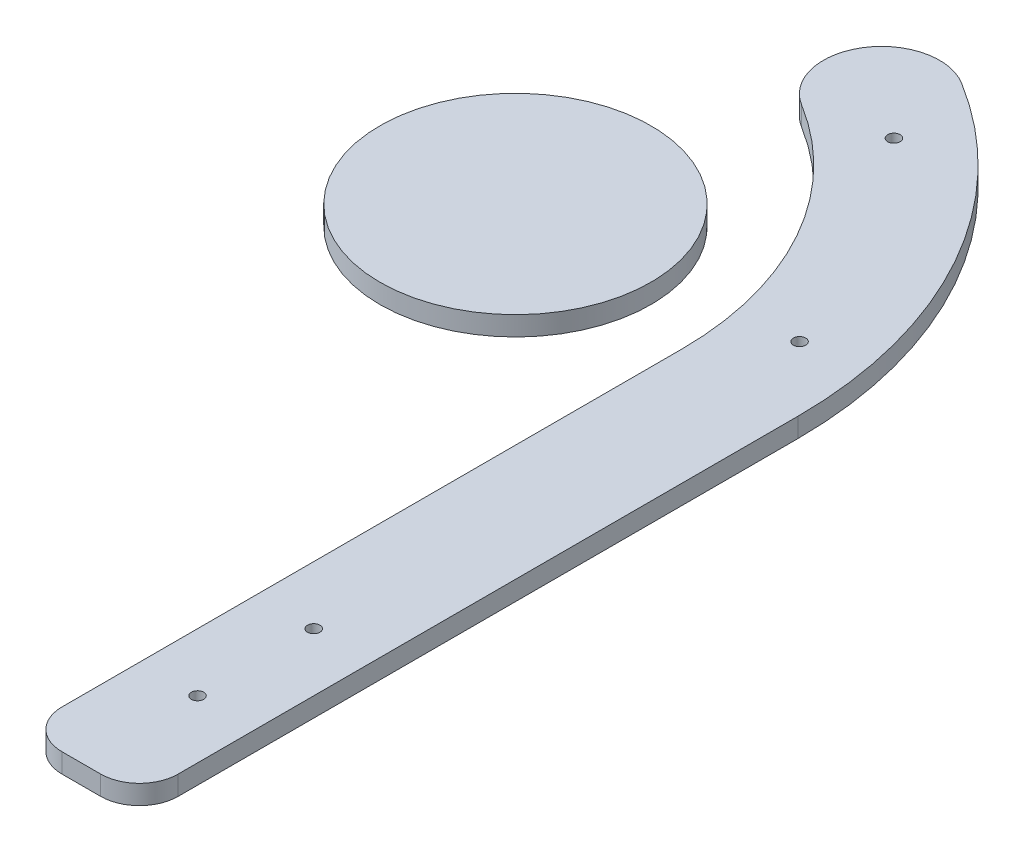
ISO-10303-21;
HEADER;
FILE_DESCRIPTION(('STEP AP214'),'2;1');
FILE_NAME('part.step','',(''),(''),'','','');
FILE_SCHEMA(('AUTOMOTIVE_DESIGN { 1 0 10303 214 1 1 1 1 }'));
ENDSEC;
DATA;
#1=APPLICATION_CONTEXT('core data for automotive mechanical design processes');
#2=APPLICATION_PROTOCOL_DEFINITION('international standard','automotive_design',2000,#1);
#3=PRODUCT_CONTEXT('',#1,'mechanical');
#4=PRODUCT('Part','Part','',(#3));
#5=PRODUCT_RELATED_PRODUCT_CATEGORY('part','',(#4));
#6=PRODUCT_DEFINITION_FORMATION('','',#4);
#7=PRODUCT_DEFINITION_CONTEXT('part definition',#1,'design');
#8=PRODUCT_DEFINITION('design','',#6,#7);
#9=PRODUCT_DEFINITION_SHAPE('','',#8);
#10=(LENGTH_UNIT() NAMED_UNIT(*) SI_UNIT(.MILLI.,.METRE.));
#11=(NAMED_UNIT(*) PLANE_ANGLE_UNIT() SI_UNIT($,.RADIAN.));
#12=(NAMED_UNIT(*) SI_UNIT($,.STERADIAN.) SOLID_ANGLE_UNIT());
#13=UNCERTAINTY_MEASURE_WITH_UNIT(LENGTH_MEASURE(1.E-05),#10,'distance_accuracy_value','');
#14=(GEOMETRIC_REPRESENTATION_CONTEXT(3) GLOBAL_UNCERTAINTY_ASSIGNED_CONTEXT((#13)) GLOBAL_UNIT_ASSIGNED_CONTEXT((#10,
#11,#12)) REPRESENTATION_CONTEXT('',''));
#15=CARTESIAN_POINT('',(0.,0.,0.));
#16=DIRECTION('',(0.,0.,1.));
#17=DIRECTION('',(1.,0.,0.));
#18=AXIS2_PLACEMENT_3D('',#15,#16,#17);
#19=CARTESIAN_POINT('',(-53.914829358916,5.,-180.99626119431));
#20=DIRECTION('',(0.,-1.,0.));
#21=DIRECTION('',(0.,0.,-1.));
#22=AXIS2_PLACEMENT_3D('',#19,#20,#21);
#23=CYLINDRICAL_SURFACE('',#22,35.);
#24=CARTESIAN_POINT('',(-53.914829358916,5.,-180.99626119431));
#25=DIRECTION('',(0.,1.,0.));
#26=DIRECTION('',(0.,0.,1.));
#27=AXIS2_PLACEMENT_3D('',#24,#25,#26);
#28=CIRCLE('',#27,35.);
#29=CARTESIAN_POINT('',(-53.914829358916,5.,-145.99626119431));
#30=VERTEX_POINT('',#29);
#31=EDGE_CURVE('E11',#30,#30,#28,.T.);
#32=ORIENTED_EDGE('',*,*,#31,.F.);
#33=EDGE_LOOP('',(#32));
#34=FACE_BOUND('',#33,.T.);
#35=CARTESIAN_POINT('',(-53.914829358916,0.,-180.99626119431));
#36=DIRECTION('',(0.,1.,0.));
#37=DIRECTION('',(0.,0.,1.));
#38=AXIS2_PLACEMENT_3D('',#35,#36,#37);
#39=CIRCLE('',#38,35.);
#40=CARTESIAN_POINT('',(-53.914829358916,0.,-145.99626119431));
#41=VERTEX_POINT('',#40);
#42=EDGE_CURVE('E42',#41,#41,#39,.T.);
#43=ORIENTED_EDGE('',*,*,#42,.T.);
#44=EDGE_LOOP('',(#43));
#45=FACE_BOUND('',#44,.T.);
#46=ADVANCED_FACE('F39',(#34,#45),#23,.T.);
#47=CARTESIAN_POINT('',(-53.914829358916,5.,-180.99626119431));
#48=DIRECTION('',(0.,1.,0.));
#49=DIRECTION('',(0.,0.,1.));
#50=AXIS2_PLACEMENT_3D('',#47,#48,#49);
#51=PLANE('',#50);
#52=ORIENTED_EDGE('',*,*,#31,.T.);
#53=EDGE_LOOP('',(#52));
#54=FACE_BOUND('',#53,.T.);
#55=ADVANCED_FACE('F54',(#54),#51,.T.);
#56=CARTESIAN_POINT('',(-53.914829358916,0.,-180.99626119431));
#57=DIRECTION('',(0.,1.,0.));
#58=DIRECTION('',(0.,0.,1.));
#59=AXIS2_PLACEMENT_3D('',#56,#57,#58);
#60=PLANE('',#59);
#61=ORIENTED_EDGE('',*,*,#42,.F.);
#62=EDGE_LOOP('',(#61));
#63=FACE_BOUND('',#62,.T.);
#64=ADVANCED_FACE('F52',(#63),#60,.F.);
#65=CLOSED_SHELL('',(#46,#55,#64));
#66=MANIFOLD_SOLID_BREP('B2',#65);
#67=CARTESIAN_POINT('',(-82.3355871184759,5.,-170.));
#68=DIRECTION('',(0.,-1.,0.));
#69=DIRECTION('',(0.,0.,-1.));
#70=AXIS2_PLACEMENT_3D('',#67,#68,#69);
#71=CYLINDRICAL_SURFACE('',#70,82.335587118476);
#72=CARTESIAN_POINT('',(-82.3355871184759,0.,-170.));
#73=DIRECTION('',(0.,-1.,0.));
#74=DIRECTION('',(0.,0.,-1.));
#75=AXIS2_PLACEMENT_3D('',#72,#73,#74);
#76=CIRCLE('',#75,82.335587118476);
#77=CARTESIAN_POINT('',(-39.1611337023978,0.,-240.107884566338));
#78=VERTEX_POINT('',#77);
#79=CARTESIAN_POINT('',(0.,0.,-170.));
#80=VERTEX_POINT('',#79);
#81=EDGE_CURVE('E177',#78,#80,#76,.T.);
#82=ORIENTED_EDGE('',*,*,#81,.T.);
#83=DIRECTION('',(0.,-1.,0.));
#84=VECTOR('',#83,1.);
#85=CARTESIAN_POINT('',(0.,5.,-170.));
#86=LINE('',#85,#84);
#87=CARTESIAN_POINT('',(0.,5.,-170.));
#88=VERTEX_POINT('',#87);
#89=EDGE_CURVE('E37',#88,#80,#86,.T.);
#90=ORIENTED_EDGE('',*,*,#89,.F.);
#91=CARTESIAN_POINT('',(-82.3355871184759,5.,-170.));
#92=DIRECTION('',(0.,-1.,0.));
#93=DIRECTION('',(0.,0.,-1.));
#94=AXIS2_PLACEMENT_3D('',#91,#92,#93);
#95=CIRCLE('',#94,82.335587118476);
#96=CARTESIAN_POINT('',(-39.1611337023978,5.,-240.107884566338));
#97=VERTEX_POINT('',#96);
#98=EDGE_CURVE('E193',#97,#88,#95,.T.);
#99=ORIENTED_EDGE('',*,*,#98,.F.);
#100=DIRECTION('',(0.,-1.,0.));
#101=VECTOR('',#100,1.);
#102=CARTESIAN_POINT('',(-39.1611337023978,5.,-240.107884566338));
#103=LINE('',#102,#101);
#104=EDGE_CURVE('E173',#97,#78,#103,.T.);
#105=ORIENTED_EDGE('',*,*,#104,.T.);
#106=EDGE_LOOP('',(#82,#90,#99,#105));
#107=FACE_BOUND('',#106,.T.);
#108=ADVANCED_FACE('F80',(#107),#71,.F.);
#109=CARTESIAN_POINT('',(0.,5.,-50.));
#110=DIRECTION('',(1.,0.,0.));
#111=DIRECTION('',(0.,0.,-1.));
#112=AXIS2_PLACEMENT_3D('',#109,#110,#111);
#113=PLANE('',#112);
#114=DIRECTION('',(0.,0.,1.));
#115=VECTOR('',#114,1.);
#116=CARTESIAN_POINT('',(0.,0.,-50.));
#117=LINE('',#116,#115);
#118=CARTESIAN_POINT('',(0.,0.,-10.0000000000001));
#119=VERTEX_POINT('',#118);
#120=EDGE_CURVE('E180',#80,#119,#117,.T.);
#121=ORIENTED_EDGE('',*,*,#120,.T.);
#122=DIRECTION('',(0.,-1.,0.));
#123=VECTOR('',#122,1.);
#124=CARTESIAN_POINT('',(0.,5.,-10.0000000000001));
#125=LINE('',#124,#123);
#126=CARTESIAN_POINT('',(0.,5.,-10.0000000000001));
#127=VERTEX_POINT('',#126);
#128=EDGE_CURVE('E89',#127,#119,#125,.T.);
#129=ORIENTED_EDGE('',*,*,#128,.F.);
#130=DIRECTION('',(0.,0.,1.));
#131=VECTOR('',#130,1.);
#132=CARTESIAN_POINT('',(0.,5.,-50.));
#133=LINE('',#132,#131);
#134=EDGE_CURVE('E141',#88,#127,#133,.T.);
#135=ORIENTED_EDGE('',*,*,#134,.F.);
#136=ORIENTED_EDGE('',*,*,#89,.T.);
#137=EDGE_LOOP('',(#121,#129,#135,#136));
#138=FACE_BOUND('',#137,.T.);
#139=ADVANCED_FACE('F262',(#138),#113,.F.);
#140=CARTESIAN_POINT('',(10.,5.,-10.));
#141=DIRECTION('',(0.,-1.,0.));
#142=DIRECTION('',(0.,0.,-1.));
#143=AXIS2_PLACEMENT_3D('',#140,#141,#142);
#144=CYLINDRICAL_SURFACE('',#143,10.);
#145=CARTESIAN_POINT('',(10.,0.,-10.));
#146=DIRECTION('',(0.,1.,0.));
#147=DIRECTION('',(0.,0.,1.));
#148=AXIS2_PLACEMENT_3D('',#145,#146,#147);
#149=CIRCLE('',#148,10.);
#150=CARTESIAN_POINT('',(10.0000000000001,0.,0.));
#151=VERTEX_POINT('',#150);
#152=EDGE_CURVE('E183',#119,#151,#149,.T.);
#153=ORIENTED_EDGE('',*,*,#152,.T.);
#154=DIRECTION('',(0.,-1.,0.));
#155=VECTOR('',#154,1.);
#156=CARTESIAN_POINT('',(10.0000000000001,5.,0.));
#157=LINE('',#156,#155);
#158=CARTESIAN_POINT('',(10.0000000000001,5.,0.));
#159=VERTEX_POINT('',#158);
#160=EDGE_CURVE('E200',#159,#151,#157,.T.);
#161=ORIENTED_EDGE('',*,*,#160,.F.);
#162=CARTESIAN_POINT('',(10.,5.,-10.));
#163=DIRECTION('',(0.,1.,0.));
#164=DIRECTION('',(0.,0.,1.));
#165=AXIS2_PLACEMENT_3D('',#162,#163,#164);
#166=CIRCLE('',#165,10.);
#167=EDGE_CURVE('E230',#127,#159,#166,.T.);
#168=ORIENTED_EDGE('',*,*,#167,.F.);
#169=ORIENTED_EDGE('',*,*,#128,.T.);
#170=EDGE_LOOP('',(#153,#161,#168,#169));
#171=FACE_BOUND('',#170,.T.);
#172=ADVANCED_FACE('F266',(#171),#144,.T.);
#173=CARTESIAN_POINT('',(10.0000000000001,5.,0.));
#174=DIRECTION('',(0.,0.,-1.));
#175=DIRECTION('',(-1.,0.,0.));
#176=AXIS2_PLACEMENT_3D('',#173,#174,#175);
#177=PLANE('',#176);
#178=DIRECTION('',(1.,0.,0.));
#179=VECTOR('',#178,1.);
#180=CARTESIAN_POINT('',(10.0000000000001,0.,0.));
#181=LINE('',#180,#179);
#182=CARTESIAN_POINT('',(19.9999999999999,0.,0.));
#183=VERTEX_POINT('',#182);
#184=EDGE_CURVE('E185',#151,#183,#181,.T.);
#185=ORIENTED_EDGE('',*,*,#184,.T.);
#186=DIRECTION('',(0.,-1.,0.));
#187=VECTOR('',#186,1.);
#188=CARTESIAN_POINT('',(19.9999999999999,5.,0.));
#189=LINE('',#188,#187);
#190=CARTESIAN_POINT('',(19.9999999999999,5.,0.));
#191=VERTEX_POINT('',#190);
#192=EDGE_CURVE('E197',#191,#183,#189,.T.);
#193=ORIENTED_EDGE('',*,*,#192,.F.);
#194=DIRECTION('',(1.,0.,0.));
#195=VECTOR('',#194,1.);
#196=CARTESIAN_POINT('',(10.0000000000001,5.,0.));
#197=LINE('',#196,#195);
#198=EDGE_CURVE('E232',#159,#191,#197,.T.);
#199=ORIENTED_EDGE('',*,*,#198,.F.);
#200=ORIENTED_EDGE('',*,*,#160,.T.);
#201=EDGE_LOOP('',(#185,#193,#199,#200));
#202=FACE_BOUND('',#201,.T.);
#203=ADVANCED_FACE('F238',(#202),#177,.F.);
#204=CARTESIAN_POINT('',(20.,5.,-10.));
#205=DIRECTION('',(0.,-1.,0.));
#206=DIRECTION('',(0.,0.,-1.));
#207=AXIS2_PLACEMENT_3D('',#204,#205,#206);
#208=CYLINDRICAL_SURFACE('',#207,10.);
#209=CARTESIAN_POINT('',(20.,0.,-10.));
#210=DIRECTION('',(0.,1.,0.));
#211=DIRECTION('',(0.,0.,1.));
#212=AXIS2_PLACEMENT_3D('',#209,#210,#211);
#213=CIRCLE('',#212,10.);
#214=CARTESIAN_POINT('',(30.,0.,-10.0000000000001));
#215=VERTEX_POINT('',#214);
#216=EDGE_CURVE('E187',#183,#215,#213,.T.);
#217=ORIENTED_EDGE('',*,*,#216,.T.);
#218=DIRECTION('',(0.,-1.,0.));
#219=VECTOR('',#218,1.);
#220=CARTESIAN_POINT('',(30.,5.,-10.0000000000001));
#221=LINE('',#220,#219);
#222=CARTESIAN_POINT('',(30.,5.,-10.0000000000001));
#223=VERTEX_POINT('',#222);
#224=EDGE_CURVE('E168',#223,#215,#221,.T.);
#225=ORIENTED_EDGE('',*,*,#224,.F.);
#226=CARTESIAN_POINT('',(20.,5.,-10.));
#227=DIRECTION('',(0.,1.,0.));
#228=DIRECTION('',(0.,0.,1.));
#229=AXIS2_PLACEMENT_3D('',#226,#227,#228);
#230=CIRCLE('',#229,10.);
#231=EDGE_CURVE('E160',#191,#223,#230,.T.);
#232=ORIENTED_EDGE('',*,*,#231,.F.);
#233=ORIENTED_EDGE('',*,*,#192,.T.);
#234=EDGE_LOOP('',(#217,#225,#232,#233));
#235=FACE_BOUND('',#234,.T.);
#236=ADVANCED_FACE('F242',(#235),#208,.T.);
#237=CARTESIAN_POINT('',(30.,5.,-170.));
#238=DIRECTION('',(-1.,0.,0.));
#239=DIRECTION('',(0.,0.,1.));
#240=AXIS2_PLACEMENT_3D('',#237,#238,#239);
#241=PLANE('',#240);
#242=DIRECTION('',(0.,0.,-1.));
#243=VECTOR('',#242,1.);
#244=CARTESIAN_POINT('',(30.,0.,-170.));
#245=LINE('',#244,#243);
#246=CARTESIAN_POINT('',(30.,0.,-170.));
#247=VERTEX_POINT('',#246);
#248=EDGE_CURVE('E167',#215,#247,#245,.T.);
#249=ORIENTED_EDGE('',*,*,#248,.T.);
#250=DIRECTION('',(0.,-1.,0.));
#251=VECTOR('',#250,1.);
#252=CARTESIAN_POINT('',(30.,5.,-170.));
#253=LINE('',#252,#251);
#254=CARTESIAN_POINT('',(30.,5.,-170.));
#255=VERTEX_POINT('',#254);
#256=EDGE_CURVE('E165',#255,#247,#253,.T.);
#257=ORIENTED_EDGE('',*,*,#256,.F.);
#258=DIRECTION('',(0.,0.,-1.));
#259=VECTOR('',#258,1.);
#260=CARTESIAN_POINT('',(30.,5.,-10.0000000000001));
#261=LINE('',#260,#259);
#262=EDGE_CURVE('E154',#223,#255,#261,.T.);
#263=ORIENTED_EDGE('',*,*,#262,.F.);
#264=ORIENTED_EDGE('',*,*,#224,.T.);
#265=EDGE_LOOP('',(#249,#257,#263,#264));
#266=FACE_BOUND('',#265,.T.);
#267=ADVANCED_FACE('F166',(#266),#241,.F.);
#268=CARTESIAN_POINT('',(-82.3355871184759,5.,-170.));
#269=DIRECTION('',(0.,-1.,0.));
#270=DIRECTION('',(0.,0.,-1.));
#271=AXIS2_PLACEMENT_3D('',#268,#269,#270);
#272=CYLINDRICAL_SURFACE('',#271,112.335587118476);
#273=CARTESIAN_POINT('',(-82.3355871184759,0.,-170.));
#274=DIRECTION('',(0.,1.,0.));
#275=DIRECTION('',(0.,0.,1.));
#276=AXIS2_PLACEMENT_3D('',#273,#274,#275);
#277=CIRCLE('',#276,112.335587118476);
#278=CARTESIAN_POINT('',(-23.4299821091191,0.,-265.652568348865));
#279=VERTEX_POINT('',#278);
#280=EDGE_CURVE('E127',#247,#279,#277,.T.);
#281=ORIENTED_EDGE('',*,*,#280,.T.);
#282=DIRECTION('',(0.,-1.,0.));
#283=VECTOR('',#282,1.);
#284=CARTESIAN_POINT('',(-23.4299821091191,5.,-265.652568348865));
#285=LINE('',#284,#283);
#286=CARTESIAN_POINT('',(-23.4299821091191,5.,-265.652568348865));
#287=VERTEX_POINT('',#286);
#288=EDGE_CURVE('E169',#287,#279,#285,.T.);
#289=ORIENTED_EDGE('',*,*,#288,.F.);
#290=CARTESIAN_POINT('',(-82.3355871184759,5.,-170.));
#291=DIRECTION('',(0.,1.,0.));
#292=DIRECTION('',(0.,0.,1.));
#293=AXIS2_PLACEMENT_3D('',#290,#291,#292);
#294=CIRCLE('',#293,112.335587118476);
#295=EDGE_CURVE('E158',#255,#287,#294,.T.);
#296=ORIENTED_EDGE('',*,*,#295,.F.);
#297=ORIENTED_EDGE('',*,*,#256,.T.);
#298=EDGE_LOOP('',(#281,#289,#296,#297));
#299=FACE_BOUND('',#298,.T.);
#300=ADVANCED_FACE('F171',(#299),#272,.T.);
#301=CARTESIAN_POINT('',(-31.2955579057585,5.,-252.880226457602));
#302=DIRECTION('',(0.,-1.,0.));
#303=DIRECTION('',(0.,0.,-1.));
#304=AXIS2_PLACEMENT_3D('',#301,#302,#303);
#305=CYLINDRICAL_SURFACE('',#304,15.);
#306=CARTESIAN_POINT('',(-31.2955579057585,0.,-252.880226457602));
#307=DIRECTION('',(0.,1.,0.));
#308=DIRECTION('',(0.,0.,1.));
#309=AXIS2_PLACEMENT_3D('',#306,#307,#308);
#310=CIRCLE('',#309,15.);
#311=EDGE_CURVE('E133',#279,#78,#310,.T.);
#312=ORIENTED_EDGE('',*,*,#311,.T.);
#313=ORIENTED_EDGE('',*,*,#104,.F.);
#314=CARTESIAN_POINT('',(-31.2955579057585,5.,-252.880226457602));
#315=DIRECTION('',(0.,1.,0.));
#316=DIRECTION('',(0.,0.,1.));
#317=AXIS2_PLACEMENT_3D('',#314,#315,#316);
#318=CIRCLE('',#317,15.);
#319=EDGE_CURVE('E98',#287,#97,#318,.T.);
#320=ORIENTED_EDGE('',*,*,#319,.F.);
#321=ORIENTED_EDGE('',*,*,#288,.T.);
#322=EDGE_LOOP('',(#312,#313,#320,#321));
#323=FACE_BOUND('',#322,.T.);
#324=ADVANCED_FACE('F250',(#323),#305,.T.);
#325=CARTESIAN_POINT('',(-82.3355871184759,5.,-170.));
#326=DIRECTION('',(0.,-1.,0.));
#327=DIRECTION('',(0.,0.,-1.));
#328=AXIS2_PLACEMENT_3D('',#325,#326,#327);
#329=PLANE('',#328);
#330=CARTESIAN_POINT('',(-19.7694777371551,5.,-244.563385629832));
#331=DIRECTION('',(0.,1.,0.));
#332=DIRECTION('',(0.,0.,1.));
#333=AXIS2_PLACEMENT_3D('',#330,#331,#332);
#334=CIRCLE('',#333,1.6);
#335=CARTESIAN_POINT('',(-19.7694777371551,5.,-242.963385629832));
#336=VERTEX_POINT('',#335);
#337=EDGE_CURVE('E218',#336,#336,#334,.T.);
#338=ORIENTED_EDGE('',*,*,#337,.F.);
#339=EDGE_LOOP('',(#338));
#340=FACE_BOUND('',#339,.T.);
#341=CARTESIAN_POINT('',(13.5212537197944,5.,-186.902147325264));
#342=DIRECTION('',(0.,1.,0.));
#343=DIRECTION('',(0.,0.,1.));
#344=AXIS2_PLACEMENT_3D('',#341,#342,#343);
#345=CIRCLE('',#344,1.6);
#346=CARTESIAN_POINT('',(13.5212537197944,5.,-185.302147325264));
#347=VERTEX_POINT('',#346);
#348=EDGE_CURVE('E207',#347,#347,#345,.T.);
#349=ORIENTED_EDGE('',*,*,#348,.F.);
#350=EDGE_LOOP('',(#349));
#351=FACE_BOUND('',#350,.T.);
#352=CARTESIAN_POINT('',(15.,5.,-30.));
#353=DIRECTION('',(0.,1.,0.));
#354=DIRECTION('',(0.,0.,1.));
#355=AXIS2_PLACEMENT_3D('',#352,#353,#354);
#356=CIRCLE('',#355,1.6);
#357=CARTESIAN_POINT('',(15.,5.,-28.4));
#358=VERTEX_POINT('',#357);
#359=EDGE_CURVE('E206',#358,#358,#356,.T.);
#360=ORIENTED_EDGE('',*,*,#359,.F.);
#361=EDGE_LOOP('',(#360));
#362=FACE_BOUND('',#361,.T.);
#363=CARTESIAN_POINT('',(15.,5.,-60.));
#364=DIRECTION('',(0.,1.,0.));
#365=DIRECTION('',(0.,0.,1.));
#366=AXIS2_PLACEMENT_3D('',#363,#364,#365);
#367=CIRCLE('',#366,1.6);
#368=CARTESIAN_POINT('',(15.,5.,-58.4));
#369=VERTEX_POINT('',#368);
#370=EDGE_CURVE('E222',#369,#369,#367,.T.);
#371=ORIENTED_EDGE('',*,*,#370,.F.);
#372=EDGE_LOOP('',(#371));
#373=FACE_BOUND('',#372,.T.);
#374=ORIENTED_EDGE('',*,*,#98,.T.);
#375=ORIENTED_EDGE('',*,*,#134,.T.);
#376=ORIENTED_EDGE('',*,*,#167,.T.);
#377=ORIENTED_EDGE('',*,*,#198,.T.);
#378=ORIENTED_EDGE('',*,*,#231,.T.);
#379=ORIENTED_EDGE('',*,*,#262,.T.);
#380=ORIENTED_EDGE('',*,*,#295,.T.);
#381=ORIENTED_EDGE('',*,*,#319,.T.);
#382=EDGE_LOOP('',(#374,#375,#376,#377,#378,#379,#380,#381));
#383=FACE_BOUND('',#382,.T.);
#384=ADVANCED_FACE('F156',(#340,#351,#362,#373,#383),#329,.F.);
#385=CARTESIAN_POINT('',(-82.3355871184759,0.,-170.));
#386=DIRECTION('',(0.,-1.,0.));
#387=DIRECTION('',(0.,0.,-1.));
#388=AXIS2_PLACEMENT_3D('',#385,#386,#387);
#389=PLANE('',#388);
#390=CARTESIAN_POINT('',(-19.7694777371551,0.,-244.563385629832));
#391=DIRECTION('',(0.,-1.,0.));
#392=DIRECTION('',(0.,0.,-1.));
#393=AXIS2_PLACEMENT_3D('',#390,#391,#392);
#394=CIRCLE('',#393,1.6);
#395=CARTESIAN_POINT('',(-19.7694777371551,0.,-246.163385629832));
#396=VERTEX_POINT('',#395);
#397=EDGE_CURVE('E83',#396,#396,#394,.T.);
#398=ORIENTED_EDGE('',*,*,#397,.F.);
#399=EDGE_LOOP('',(#398));
#400=FACE_BOUND('',#399,.T.);
#401=CARTESIAN_POINT('',(13.5212537197944,0.,-186.902147325264));
#402=DIRECTION('',(0.,-1.,0.));
#403=DIRECTION('',(0.,0.,-1.));
#404=AXIS2_PLACEMENT_3D('',#401,#402,#403);
#405=CIRCLE('',#404,1.6);
#406=CARTESIAN_POINT('',(13.5212537197944,0.,-188.502147325264));
#407=VERTEX_POINT('',#406);
#408=EDGE_CURVE('E204',#407,#407,#405,.T.);
#409=ORIENTED_EDGE('',*,*,#408,.F.);
#410=EDGE_LOOP('',(#409));
#411=FACE_BOUND('',#410,.T.);
#412=CARTESIAN_POINT('',(15.,0.,-30.));
#413=DIRECTION('',(0.,1.,0.));
#414=DIRECTION('',(0.,0.,1.));
#415=AXIS2_PLACEMENT_3D('',#412,#413,#414);
#416=CIRCLE('',#415,1.6);
#417=CARTESIAN_POINT('',(15.,0.,-28.4));
#418=VERTEX_POINT('',#417);
#419=EDGE_CURVE('E211',#418,#418,#416,.T.);
#420=ORIENTED_EDGE('',*,*,#419,.T.);
#421=EDGE_LOOP('',(#420));
#422=FACE_BOUND('',#421,.T.);
#423=CARTESIAN_POINT('',(15.,0.,-60.));
#424=DIRECTION('',(0.,1.,0.));
#425=DIRECTION('',(0.,0.,1.));
#426=AXIS2_PLACEMENT_3D('',#423,#424,#425);
#427=CIRCLE('',#426,1.6);
#428=CARTESIAN_POINT('',(15.,0.,-58.4));
#429=VERTEX_POINT('',#428);
#430=EDGE_CURVE('E181',#429,#429,#427,.T.);
#431=ORIENTED_EDGE('',*,*,#430,.T.);
#432=EDGE_LOOP('',(#431));
#433=FACE_BOUND('',#432,.T.);
#434=ORIENTED_EDGE('',*,*,#81,.F.);
#435=ORIENTED_EDGE('',*,*,#311,.F.);
#436=ORIENTED_EDGE('',*,*,#280,.F.);
#437=ORIENTED_EDGE('',*,*,#248,.F.);
#438=ORIENTED_EDGE('',*,*,#216,.F.);
#439=ORIENTED_EDGE('',*,*,#184,.F.);
#440=ORIENTED_EDGE('',*,*,#152,.F.);
#441=ORIENTED_EDGE('',*,*,#120,.F.);
#442=EDGE_LOOP('',(#434,#435,#436,#437,#438,#439,#440,#441));
#443=FACE_BOUND('',#442,.T.);
#444=ADVANCED_FACE('F245',(#400,#411,#422,#433,#443),#389,.T.);
#445=CARTESIAN_POINT('',(15.,0.,-60.));
#446=DIRECTION('',(0.,1.,0.));
#447=DIRECTION('',(0.,0.,1.));
#448=AXIS2_PLACEMENT_3D('',#445,#446,#447);
#449=CYLINDRICAL_SURFACE('',#448,1.6);
#450=ORIENTED_EDGE('',*,*,#430,.F.);
#451=EDGE_LOOP('',(#450));
#452=FACE_BOUND('',#451,.T.);
#453=ORIENTED_EDGE('',*,*,#370,.T.);
#454=EDGE_LOOP('',(#453));
#455=FACE_BOUND('',#454,.T.);
#456=ADVANCED_FACE('F296',(#452,#455),#449,.F.);
#457=CARTESIAN_POINT('',(15.,0.,-30.));
#458=DIRECTION('',(0.,1.,0.));
#459=DIRECTION('',(0.,0.,1.));
#460=AXIS2_PLACEMENT_3D('',#457,#458,#459);
#461=CYLINDRICAL_SURFACE('',#460,1.6);
#462=ORIENTED_EDGE('',*,*,#419,.F.);
#463=EDGE_LOOP('',(#462));
#464=FACE_BOUND('',#463,.T.);
#465=ORIENTED_EDGE('',*,*,#359,.T.);
#466=EDGE_LOOP('',(#465));
#467=FACE_BOUND('',#466,.T.);
#468=ADVANCED_FACE('F301',(#464,#467),#461,.F.);
#469=CARTESIAN_POINT('',(13.5212537197944,-5.,-186.902147325264));
#470=DIRECTION('',(0.,1.,0.));
#471=DIRECTION('',(0.,0.,1.));
#472=AXIS2_PLACEMENT_3D('',#469,#470,#471);
#473=CYLINDRICAL_SURFACE('',#472,1.6);
#474=ORIENTED_EDGE('',*,*,#408,.T.);
#475=EDGE_LOOP('',(#474));
#476=FACE_BOUND('',#475,.T.);
#477=ORIENTED_EDGE('',*,*,#348,.T.);
#478=EDGE_LOOP('',(#477));
#479=FACE_BOUND('',#478,.T.);
#480=ADVANCED_FACE('F313',(#476,#479),#473,.F.);
#481=CARTESIAN_POINT('',(-19.7694777371551,-5.,-244.563385629832));
#482=DIRECTION('',(0.,1.,0.));
#483=DIRECTION('',(0.,0.,1.));
#484=AXIS2_PLACEMENT_3D('',#481,#482,#483);
#485=CYLINDRICAL_SURFACE('',#484,1.6);
#486=ORIENTED_EDGE('',*,*,#397,.T.);
#487=EDGE_LOOP('',(#486));
#488=FACE_BOUND('',#487,.T.);
#489=ORIENTED_EDGE('',*,*,#337,.T.);
#490=EDGE_LOOP('',(#489));
#491=FACE_BOUND('',#490,.T.);
#492=ADVANCED_FACE('F334',(#488,#491),#485,.F.);
#493=CLOSED_SHELL('',(#108,#139,#172,#203,#236,#267,#300,#324,#384,#444,#456,#468,#480,#492));
#494=MANIFOLD_SOLID_BREP('B6',#493);
#495=ADVANCED_BREP_SHAPE_REPRESENTATION('',(#18,#66,#494),#14);
#496=SHAPE_DEFINITION_REPRESENTATION(#9,#495);
ENDSEC;
END-ISO-10303-21;
